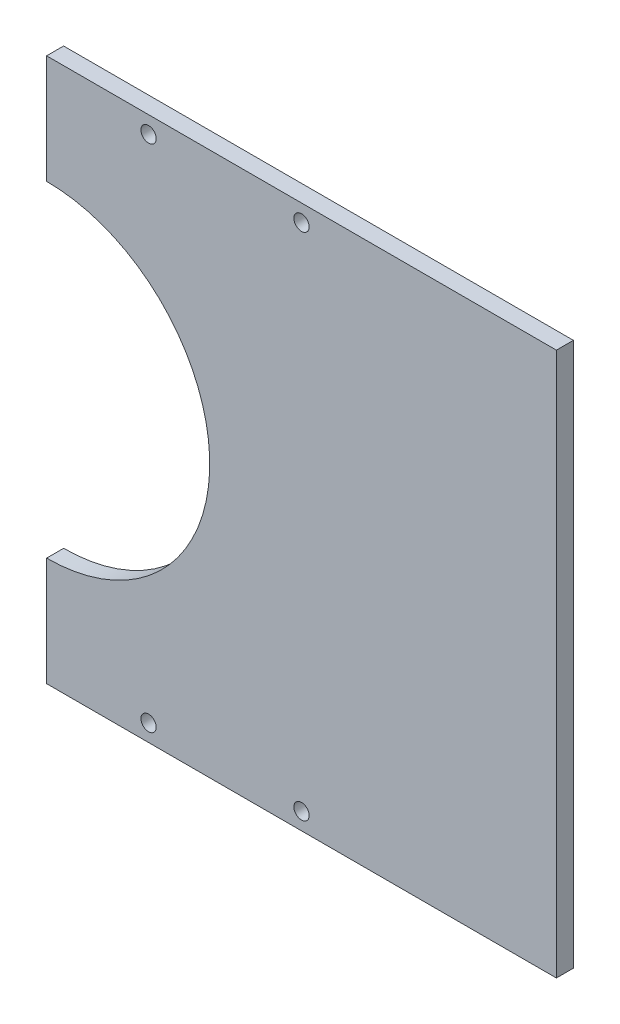
ISO-10303-21;
HEADER;
FILE_DESCRIPTION(('STEP AP214'),'2;1');
FILE_NAME('part.step','',(''),(''),'','','');
FILE_SCHEMA(('AUTOMOTIVE_DESIGN { 1 0 10303 214 1 1 1 1 }'));
ENDSEC;
DATA;
#1=APPLICATION_CONTEXT('core data for automotive mechanical design processes');
#2=APPLICATION_PROTOCOL_DEFINITION('international standard','automotive_design',2000,#1);
#3=PRODUCT_CONTEXT('',#1,'mechanical');
#4=PRODUCT('Part','Part','',(#3));
#5=PRODUCT_RELATED_PRODUCT_CATEGORY('part','',(#4));
#6=PRODUCT_DEFINITION_FORMATION('','',#4);
#7=PRODUCT_DEFINITION_CONTEXT('part definition',#1,'design');
#8=PRODUCT_DEFINITION('design','',#6,#7);
#9=PRODUCT_DEFINITION_SHAPE('','',#8);
#10=(LENGTH_UNIT() NAMED_UNIT(*) SI_UNIT(.MILLI.,.METRE.));
#11=(NAMED_UNIT(*) PLANE_ANGLE_UNIT() SI_UNIT($,.RADIAN.));
#12=(NAMED_UNIT(*) SI_UNIT($,.STERADIAN.) SOLID_ANGLE_UNIT());
#13=UNCERTAINTY_MEASURE_WITH_UNIT(LENGTH_MEASURE(1.E-05),#10,'distance_accuracy_value','');
#14=(GEOMETRIC_REPRESENTATION_CONTEXT(3) GLOBAL_UNCERTAINTY_ASSIGNED_CONTEXT((#13)) GLOBAL_UNIT_ASSIGNED_CONTEXT((#10,
#11,#12)) REPRESENTATION_CONTEXT('',''));
#15=CARTESIAN_POINT('',(0.,0.,0.));
#16=DIRECTION('',(0.,0.,1.));
#17=DIRECTION('',(1.,0.,0.));
#18=AXIS2_PLACEMENT_3D('',#15,#16,#17);
#19=CARTESIAN_POINT('',(-75.,-80.,5.));
#20=DIRECTION('',(0.,1.,0.));
#21=DIRECTION('',(-1.,0.,0.));
#22=AXIS2_PLACEMENT_3D('',#19,#20,#21);
#23=PLANE('',#22);
#24=DIRECTION('',(1.,0.,0.));
#25=VECTOR('',#24,1.);
#26=CARTESIAN_POINT('',(-75.,-80.,0.));
#27=LINE('',#26,#25);
#28=CARTESIAN_POINT('',(-75.,-80.,0.));
#29=VERTEX_POINT('',#28);
#30=CARTESIAN_POINT('',(75.,-80.,0.));
#31=VERTEX_POINT('',#30);
#32=EDGE_CURVE('E141',#29,#31,#27,.T.);
#33=ORIENTED_EDGE('',*,*,#32,.T.);
#34=DIRECTION('',(0.,0.,-1.));
#35=VECTOR('',#34,1.);
#36=CARTESIAN_POINT('',(75.,-80.,5.));
#37=LINE('',#36,#35);
#38=CARTESIAN_POINT('',(75.,-80.,5.));
#39=VERTEX_POINT('',#38);
#40=EDGE_CURVE('E11',#39,#31,#37,.T.);
#41=ORIENTED_EDGE('',*,*,#40,.F.);
#42=DIRECTION('',(1.,0.,0.));
#43=VECTOR('',#42,1.);
#44=CARTESIAN_POINT('',(-75.,-80.,5.));
#45=LINE('',#44,#43);
#46=CARTESIAN_POINT('',(-75.,-80.,5.));
#47=VERTEX_POINT('',#46);
#48=EDGE_CURVE('E157',#47,#39,#45,.T.);
#49=ORIENTED_EDGE('',*,*,#48,.F.);
#50=DIRECTION('',(0.,0.,-1.));
#51=VECTOR('',#50,1.);
#52=CARTESIAN_POINT('',(-75.,-80.,5.));
#53=LINE('',#52,#51);
#54=EDGE_CURVE('E137',#47,#29,#53,.T.);
#55=ORIENTED_EDGE('',*,*,#54,.T.);
#56=EDGE_LOOP('',(#33,#41,#49,#55));
#57=FACE_BOUND('',#56,.T.);
#58=ADVANCED_FACE('F49',(#57),#23,.F.);
#59=CARTESIAN_POINT('',(75.,80.,5.));
#60=DIRECTION('',(-1.,0.,0.));
#61=DIRECTION('',(0.,-1.,0.));
#62=AXIS2_PLACEMENT_3D('',#59,#60,#61);
#63=PLANE('',#62);
#64=DIRECTION('',(0.,1.,0.));
#65=VECTOR('',#64,1.);
#66=CARTESIAN_POINT('',(75.,80.,0.));
#67=LINE('',#66,#65);
#68=CARTESIAN_POINT('',(75.,80.,0.));
#69=VERTEX_POINT('',#68);
#70=EDGE_CURVE('E145',#31,#69,#67,.T.);
#71=ORIENTED_EDGE('',*,*,#70,.T.);
#72=DIRECTION('',(0.,0.,-1.));
#73=VECTOR('',#72,1.);
#74=CARTESIAN_POINT('',(75.,80.,5.));
#75=LINE('',#74,#73);
#76=CARTESIAN_POINT('',(75.,80.,5.));
#77=VERTEX_POINT('',#76);
#78=EDGE_CURVE('E58',#77,#69,#75,.T.);
#79=ORIENTED_EDGE('',*,*,#78,.F.);
#80=DIRECTION('',(0.,1.,0.));
#81=VECTOR('',#80,1.);
#82=CARTESIAN_POINT('',(75.,80.,5.));
#83=LINE('',#82,#81);
#84=EDGE_CURVE('E103',#39,#77,#83,.T.);
#85=ORIENTED_EDGE('',*,*,#84,.F.);
#86=ORIENTED_EDGE('',*,*,#40,.T.);
#87=EDGE_LOOP('',(#71,#79,#85,#86));
#88=FACE_BOUND('',#87,.T.);
#89=ADVANCED_FACE('F186',(#88),#63,.F.);
#90=CARTESIAN_POINT('',(-75.,80.,5.));
#91=DIRECTION('',(0.,-1.,0.));
#92=DIRECTION('',(1.,0.,0.));
#93=AXIS2_PLACEMENT_3D('',#90,#91,#92);
#94=PLANE('',#93);
#95=DIRECTION('',(-1.,0.,0.));
#96=VECTOR('',#95,1.);
#97=CARTESIAN_POINT('',(-75.,80.,0.));
#98=LINE('',#97,#96);
#99=CARTESIAN_POINT('',(-75.,80.,0.));
#100=VERTEX_POINT('',#99);
#101=EDGE_CURVE('E149',#69,#100,#98,.T.);
#102=ORIENTED_EDGE('',*,*,#101,.T.);
#103=DIRECTION('',(0.,0.,-1.));
#104=VECTOR('',#103,1.);
#105=CARTESIAN_POINT('',(-75.,80.,5.));
#106=LINE('',#105,#104);
#107=CARTESIAN_POINT('',(-75.,80.,5.));
#108=VERTEX_POINT('',#107);
#109=EDGE_CURVE('E127',#108,#100,#106,.T.);
#110=ORIENTED_EDGE('',*,*,#109,.F.);
#111=DIRECTION('',(-1.,0.,0.));
#112=VECTOR('',#111,1.);
#113=CARTESIAN_POINT('',(-75.,80.,5.));
#114=LINE('',#113,#112);
#115=EDGE_CURVE('E116',#77,#108,#114,.T.);
#116=ORIENTED_EDGE('',*,*,#115,.F.);
#117=ORIENTED_EDGE('',*,*,#78,.T.);
#118=EDGE_LOOP('',(#102,#110,#116,#117));
#119=FACE_BOUND('',#118,.T.);
#120=ADVANCED_FACE('F168',(#119),#94,.F.);
#121=CARTESIAN_POINT('',(-75.,80.,5.));
#122=DIRECTION('',(1.,0.,0.));
#123=DIRECTION('',(0.,0.,-1.));
#124=AXIS2_PLACEMENT_3D('',#121,#122,#123);
#125=PLANE('',#124);
#126=DIRECTION('',(0.,-1.,0.));
#127=VECTOR('',#126,1.);
#128=CARTESIAN_POINT('',(-75.,80.,0.));
#129=LINE('',#128,#127);
#130=CARTESIAN_POINT('',(-75.,48.,0.));
#131=VERTEX_POINT('',#130);
#132=EDGE_CURVE('E125',#100,#131,#129,.T.);
#133=ORIENTED_EDGE('',*,*,#132,.T.);
#134=DIRECTION('',(0.,0.,-1.));
#135=VECTOR('',#134,1.);
#136=CARTESIAN_POINT('',(-75.,48.,5.));
#137=LINE('',#136,#135);
#138=CARTESIAN_POINT('',(-75.,48.,5.));
#139=VERTEX_POINT('',#138);
#140=EDGE_CURVE('E122',#139,#131,#137,.T.);
#141=ORIENTED_EDGE('',*,*,#140,.F.);
#142=DIRECTION('',(0.,-1.,0.));
#143=VECTOR('',#142,1.);
#144=CARTESIAN_POINT('',(-75.,80.,5.));
#145=LINE('',#144,#143);
#146=EDGE_CURVE('E110',#108,#139,#145,.T.);
#147=ORIENTED_EDGE('',*,*,#146,.F.);
#148=ORIENTED_EDGE('',*,*,#109,.T.);
#149=EDGE_LOOP('',(#133,#141,#147,#148));
#150=FACE_BOUND('',#149,.T.);
#151=ADVANCED_FACE('F123',(#150),#125,.F.);
#152=CARTESIAN_POINT('',(-75.,0.,5.));
#153=DIRECTION('',(0.,0.,-1.));
#154=DIRECTION('',(-1.,0.,0.));
#155=AXIS2_PLACEMENT_3D('',#152,#153,#154);
#156=CYLINDRICAL_SURFACE('',#155,48.);
#157=CARTESIAN_POINT('',(-75.,0.,0.));
#158=DIRECTION('',(0.,0.,-1.));
#159=DIRECTION('',(1.,0.,0.));
#160=AXIS2_PLACEMENT_3D('',#157,#158,#159);
#161=CIRCLE('',#160,48.);
#162=CARTESIAN_POINT('',(-75.,-48.,0.));
#163=VERTEX_POINT('',#162);
#164=EDGE_CURVE('E89',#131,#163,#161,.T.);
#165=ORIENTED_EDGE('',*,*,#164,.T.);
#166=DIRECTION('',(0.,0.,-1.));
#167=VECTOR('',#166,1.);
#168=CARTESIAN_POINT('',(-75.,-48.,5.));
#169=LINE('',#168,#167);
#170=CARTESIAN_POINT('',(-75.,-48.,5.));
#171=VERTEX_POINT('',#170);
#172=EDGE_CURVE('E128',#171,#163,#169,.T.);
#173=ORIENTED_EDGE('',*,*,#172,.F.);
#174=CARTESIAN_POINT('',(-75.,0.,5.));
#175=DIRECTION('',(0.,0.,-1.));
#176=DIRECTION('',(1.,0.,0.));
#177=AXIS2_PLACEMENT_3D('',#174,#175,#176);
#178=CIRCLE('',#177,48.);
#179=EDGE_CURVE('E114',#139,#171,#178,.T.);
#180=ORIENTED_EDGE('',*,*,#179,.F.);
#181=ORIENTED_EDGE('',*,*,#140,.T.);
#182=EDGE_LOOP('',(#165,#173,#180,#181));
#183=FACE_BOUND('',#182,.T.);
#184=ADVANCED_FACE('F130',(#183),#156,.F.);
#185=CARTESIAN_POINT('',(-75.,-48.,5.));
#186=DIRECTION('',(1.,0.,0.));
#187=DIRECTION('',(0.,0.,-1.));
#188=AXIS2_PLACEMENT_3D('',#185,#186,#187);
#189=PLANE('',#188);
#190=DIRECTION('',(0.,-1.,0.));
#191=VECTOR('',#190,1.);
#192=CARTESIAN_POINT('',(-75.,-48.,0.));
#193=LINE('',#192,#191);
#194=EDGE_CURVE('E95',#163,#29,#193,.T.);
#195=ORIENTED_EDGE('',*,*,#194,.T.);
#196=ORIENTED_EDGE('',*,*,#54,.F.);
#197=DIRECTION('',(0.,-1.,0.));
#198=VECTOR('',#197,1.);
#199=CARTESIAN_POINT('',(-75.,-48.,5.));
#200=LINE('',#199,#198);
#201=EDGE_CURVE('E66',#171,#47,#200,.T.);
#202=ORIENTED_EDGE('',*,*,#201,.F.);
#203=ORIENTED_EDGE('',*,*,#172,.T.);
#204=EDGE_LOOP('',(#195,#196,#202,#203));
#205=FACE_BOUND('',#204,.T.);
#206=ADVANCED_FACE('F175',(#205),#189,.F.);
#207=CARTESIAN_POINT('',(-75.,0.,5.));
#208=DIRECTION('',(0.,0.,1.));
#209=DIRECTION('',(1.,0.,0.));
#210=AXIS2_PLACEMENT_3D('',#207,#208,#209);
#211=PLANE('',#210);
#212=CARTESIAN_POINT('',(-45.,-75.,5.));
#213=DIRECTION('',(0.,0.,1.));
#214=DIRECTION('',(1.,0.,0.));
#215=AXIS2_PLACEMENT_3D('',#212,#213,#214);
#216=CIRCLE('',#215,2.25);
#217=CARTESIAN_POINT('',(-42.75,-75.,5.));
#218=VERTEX_POINT('',#217);
#219=EDGE_CURVE('E146',#218,#218,#216,.T.);
#220=ORIENTED_EDGE('',*,*,#219,.F.);
#221=EDGE_LOOP('',(#220));
#222=FACE_BOUND('',#221,.T.);
#223=CARTESIAN_POINT('',(0.,75.,5.));
#224=DIRECTION('',(0.,0.,1.));
#225=DIRECTION('',(1.,0.,0.));
#226=AXIS2_PLACEMENT_3D('',#223,#224,#225);
#227=CIRCLE('',#226,2.25);
#228=CARTESIAN_POINT('',(2.25,75.,5.));
#229=VERTEX_POINT('',#228);
#230=EDGE_CURVE('E320',#229,#229,#227,.T.);
#231=ORIENTED_EDGE('',*,*,#230,.F.);
#232=EDGE_LOOP('',(#231));
#233=FACE_BOUND('',#232,.T.);
#234=CARTESIAN_POINT('',(-45.,75.,5.));
#235=DIRECTION('',(0.,0.,1.));
#236=DIRECTION('',(1.,0.,0.));
#237=AXIS2_PLACEMENT_3D('',#234,#235,#236);
#238=CIRCLE('',#237,2.25);
#239=CARTESIAN_POINT('',(-42.75,75.,5.));
#240=VERTEX_POINT('',#239);
#241=EDGE_CURVE('E317',#240,#240,#238,.T.);
#242=ORIENTED_EDGE('',*,*,#241,.F.);
#243=EDGE_LOOP('',(#242));
#244=FACE_BOUND('',#243,.T.);
#245=CARTESIAN_POINT('',(0.,-75.,5.));
#246=DIRECTION('',(0.,0.,1.));
#247=DIRECTION('',(1.,0.,0.));
#248=AXIS2_PLACEMENT_3D('',#245,#246,#247);
#249=CIRCLE('',#248,2.25);
#250=CARTESIAN_POINT('',(2.25,-75.,5.));
#251=VERTEX_POINT('',#250);
#252=EDGE_CURVE('E306',#251,#251,#249,.T.);
#253=ORIENTED_EDGE('',*,*,#252,.F.);
#254=EDGE_LOOP('',(#253));
#255=FACE_BOUND('',#254,.T.);
#256=ORIENTED_EDGE('',*,*,#48,.T.);
#257=ORIENTED_EDGE('',*,*,#84,.T.);
#258=ORIENTED_EDGE('',*,*,#115,.T.);
#259=ORIENTED_EDGE('',*,*,#146,.T.);
#260=ORIENTED_EDGE('',*,*,#179,.T.);
#261=ORIENTED_EDGE('',*,*,#201,.T.);
#262=EDGE_LOOP('',(#256,#257,#258,#259,#260,#261));
#263=FACE_BOUND('',#262,.T.);
#264=ADVANCED_FACE('F112',(#222,#233,#244,#255,#263),#211,.T.);
#265=CARTESIAN_POINT('',(-75.,0.,0.));
#266=DIRECTION('',(0.,0.,1.));
#267=DIRECTION('',(1.,0.,0.));
#268=AXIS2_PLACEMENT_3D('',#265,#266,#267);
#269=PLANE('',#268);
#270=CARTESIAN_POINT('',(-45.,-75.,0.));
#271=DIRECTION('',(0.,0.,1.));
#272=DIRECTION('',(1.,0.,0.));
#273=AXIS2_PLACEMENT_3D('',#270,#271,#272);
#274=CIRCLE('',#273,2.25);
#275=CARTESIAN_POINT('',(-42.75,-75.,0.));
#276=VERTEX_POINT('',#275);
#277=EDGE_CURVE('E298',#276,#276,#274,.T.);
#278=ORIENTED_EDGE('',*,*,#277,.T.);
#279=EDGE_LOOP('',(#278));
#280=FACE_BOUND('',#279,.T.);
#281=CARTESIAN_POINT('',(0.,75.,0.));
#282=DIRECTION('',(0.,0.,1.));
#283=DIRECTION('',(-1.,0.,0.));
#284=AXIS2_PLACEMENT_3D('',#281,#282,#283);
#285=CIRCLE('',#284,2.25);
#286=CARTESIAN_POINT('',(-2.25,75.,0.));
#287=VERTEX_POINT('',#286);
#288=EDGE_CURVE('E301',#287,#287,#285,.T.);
#289=ORIENTED_EDGE('',*,*,#288,.T.);
#290=EDGE_LOOP('',(#289));
#291=FACE_BOUND('',#290,.T.);
#292=CARTESIAN_POINT('',(-45.,75.,0.));
#293=DIRECTION('',(0.,0.,1.));
#294=DIRECTION('',(-1.,0.,0.));
#295=AXIS2_PLACEMENT_3D('',#292,#293,#294);
#296=CIRCLE('',#295,2.25);
#297=CARTESIAN_POINT('',(-47.25,75.,0.));
#298=VERTEX_POINT('',#297);
#299=EDGE_CURVE('E310',#298,#298,#296,.T.);
#300=ORIENTED_EDGE('',*,*,#299,.T.);
#301=EDGE_LOOP('',(#300));
#302=FACE_BOUND('',#301,.T.);
#303=CARTESIAN_POINT('',(0.,-75.,0.));
#304=DIRECTION('',(0.,0.,1.));
#305=DIRECTION('',(1.,0.,0.));
#306=AXIS2_PLACEMENT_3D('',#303,#304,#305);
#307=CIRCLE('',#306,2.25);
#308=CARTESIAN_POINT('',(2.25,-75.,0.));
#309=VERTEX_POINT('',#308);
#310=EDGE_CURVE('E300',#309,#309,#307,.T.);
#311=ORIENTED_EDGE('',*,*,#310,.T.);
#312=EDGE_LOOP('',(#311));
#313=FACE_BOUND('',#312,.T.);
#314=ORIENTED_EDGE('',*,*,#32,.F.);
#315=ORIENTED_EDGE('',*,*,#194,.F.);
#316=ORIENTED_EDGE('',*,*,#164,.F.);
#317=ORIENTED_EDGE('',*,*,#132,.F.);
#318=ORIENTED_EDGE('',*,*,#101,.F.);
#319=ORIENTED_EDGE('',*,*,#70,.F.);
#320=EDGE_LOOP('',(#314,#315,#316,#317,#318,#319));
#321=FACE_BOUND('',#320,.T.);
#322=ADVANCED_FACE('F171',(#280,#291,#302,#313,#321),#269,.F.);
#323=CARTESIAN_POINT('',(0.,-75.,0.));
#324=DIRECTION('',(0.,0.,1.));
#325=DIRECTION('',(1.,0.,0.));
#326=AXIS2_PLACEMENT_3D('',#323,#324,#325);
#327=CYLINDRICAL_SURFACE('',#326,2.25);
#328=ORIENTED_EDGE('',*,*,#252,.T.);
#329=EDGE_LOOP('',(#328));
#330=FACE_BOUND('',#329,.T.);
#331=ORIENTED_EDGE('',*,*,#310,.F.);
#332=EDGE_LOOP('',(#331));
#333=FACE_BOUND('',#332,.T.);
#334=ADVANCED_FACE('F220',(#330,#333),#327,.F.);
#335=CARTESIAN_POINT('',(-45.,75.,0.));
#336=DIRECTION('',(0.,0.,1.));
#337=DIRECTION('',(1.,0.,0.));
#338=AXIS2_PLACEMENT_3D('',#335,#336,#337);
#339=CYLINDRICAL_SURFACE('',#338,2.25);
#340=ORIENTED_EDGE('',*,*,#241,.T.);
#341=EDGE_LOOP('',(#340));
#342=FACE_BOUND('',#341,.T.);
#343=ORIENTED_EDGE('',*,*,#299,.F.);
#344=EDGE_LOOP('',(#343));
#345=FACE_BOUND('',#344,.T.);
#346=ADVANCED_FACE('F229',(#342,#345),#339,.F.);
#347=CARTESIAN_POINT('',(0.,75.,0.));
#348=DIRECTION('',(0.,0.,1.));
#349=DIRECTION('',(1.,0.,0.));
#350=AXIS2_PLACEMENT_3D('',#347,#348,#349);
#351=CYLINDRICAL_SURFACE('',#350,2.25);
#352=ORIENTED_EDGE('',*,*,#230,.T.);
#353=EDGE_LOOP('',(#352));
#354=FACE_BOUND('',#353,.T.);
#355=ORIENTED_EDGE('',*,*,#288,.F.);
#356=EDGE_LOOP('',(#355));
#357=FACE_BOUND('',#356,.T.);
#358=ADVANCED_FACE('F239',(#354,#357),#351,.F.);
#359=CARTESIAN_POINT('',(-45.,-75.,0.));
#360=DIRECTION('',(0.,0.,1.));
#361=DIRECTION('',(1.,0.,0.));
#362=AXIS2_PLACEMENT_3D('',#359,#360,#361);
#363=CYLINDRICAL_SURFACE('',#362,2.25);
#364=ORIENTED_EDGE('',*,*,#219,.T.);
#365=EDGE_LOOP('',(#364));
#366=FACE_BOUND('',#365,.T.);
#367=ORIENTED_EDGE('',*,*,#277,.F.);
#368=EDGE_LOOP('',(#367));
#369=FACE_BOUND('',#368,.T.);
#370=ADVANCED_FACE('F249',(#366,#369),#363,.F.);
#371=CLOSED_SHELL('',(#58,#89,#120,#151,#184,#206,#264,#322,#334,#346,#358,#370));
#372=MANIFOLD_SOLID_BREP('B2',#371);
#373=ADVANCED_BREP_SHAPE_REPRESENTATION('',(#18,#372),#14);
#374=SHAPE_DEFINITION_REPRESENTATION(#9,#373);
ENDSEC;
END-ISO-10303-21;
